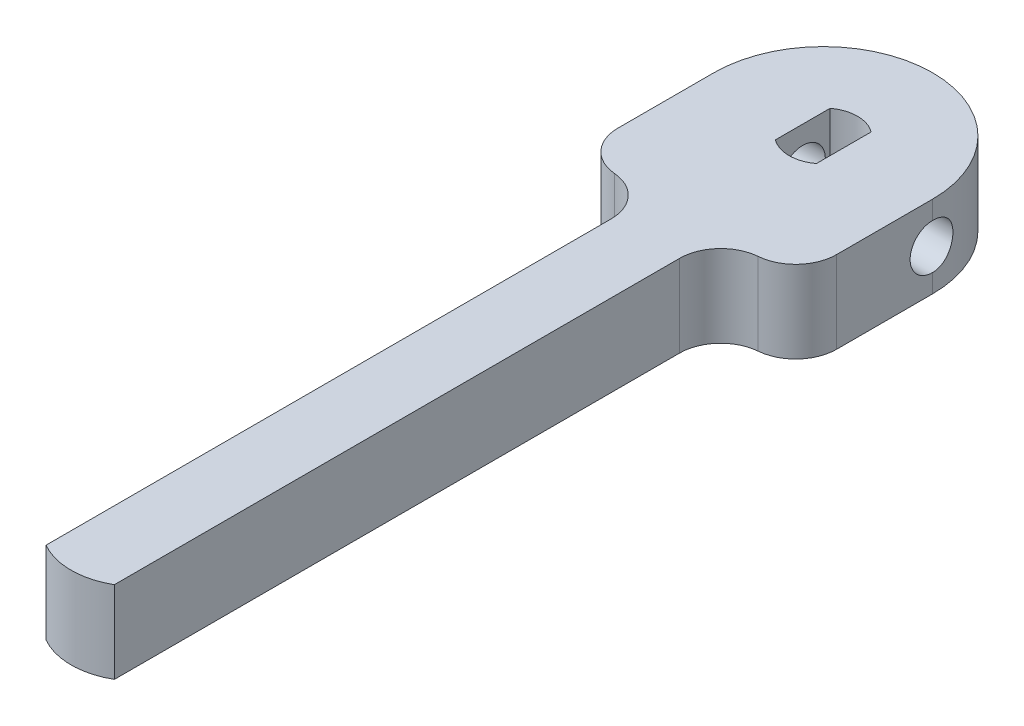
ISO-10303-21;
HEADER;
FILE_DESCRIPTION(('STEP AP214'),'2;1');
FILE_NAME('part.step','',(''),(''),'','','');
FILE_SCHEMA(('AUTOMOTIVE_DESIGN { 1 0 10303 214 1 1 1 1 }'));
ENDSEC;
DATA;
#1=APPLICATION_CONTEXT('core data for automotive mechanical design processes');
#2=APPLICATION_PROTOCOL_DEFINITION('international standard','automotive_design',2000,#1);
#3=PRODUCT_CONTEXT('',#1,'mechanical');
#4=PRODUCT('Part','Part','',(#3));
#5=PRODUCT_RELATED_PRODUCT_CATEGORY('part','',(#4));
#6=PRODUCT_DEFINITION_FORMATION('','',#4);
#7=PRODUCT_DEFINITION_CONTEXT('part definition',#1,'design');
#8=PRODUCT_DEFINITION('design','',#6,#7);
#9=PRODUCT_DEFINITION_SHAPE('','',#8);
#10=(LENGTH_UNIT() NAMED_UNIT(*) SI_UNIT(.MILLI.,.METRE.));
#11=(NAMED_UNIT(*) PLANE_ANGLE_UNIT() SI_UNIT($,.RADIAN.));
#12=(NAMED_UNIT(*) SI_UNIT($,.STERADIAN.) SOLID_ANGLE_UNIT());
#13=UNCERTAINTY_MEASURE_WITH_UNIT(LENGTH_MEASURE(1.E-05),#10,'distance_accuracy_value','');
#14=(GEOMETRIC_REPRESENTATION_CONTEXT(3) GLOBAL_UNCERTAINTY_ASSIGNED_CONTEXT((#13)) GLOBAL_UNIT_ASSIGNED_CONTEXT((#10,
#11,#12)) REPRESENTATION_CONTEXT('',''));
#15=CARTESIAN_POINT('',(0.,0.,0.));
#16=DIRECTION('',(0.,0.,1.));
#17=DIRECTION('',(1.,0.,0.));
#18=AXIS2_PLACEMENT_3D('',#15,#16,#17);
#19=CARTESIAN_POINT('',(0.,6.,0.));
#20=DIRECTION('',(0.,1.,0.));
#21=DIRECTION('',(0.,0.,1.));
#22=AXIS2_PLACEMENT_3D('',#19,#20,#21);
#23=PLANE('',#22);
#24=CARTESIAN_POINT('',(5.5,6.,13.));
#25=DIRECTION('',(0.,1.,0.));
#26=DIRECTION('',(0.,0.,1.));
#27=AXIS2_PLACEMENT_3D('',#24,#25,#26);
#28=CIRCLE('',#27,3.);
#29=CARTESIAN_POINT('',(2.5,6.,13.));
#30=VERTEX_POINT('',#29);
#31=CARTESIAN_POINT('',(5.25,6.,10.0104348142246));
#32=VERTEX_POINT('',#31);
#33=EDGE_CURVE('E419',#30,#32,#28,.F.);
#34=ORIENTED_EDGE('',*,*,#33,.T.);
#35=CARTESIAN_POINT('',(5.,6.,7.0208696284493));
#36=DIRECTION('',(0.,1.,0.));
#37=DIRECTION('',(0.,0.,1.));
#38=AXIS2_PLACEMENT_3D('',#35,#36,#37);
#39=CIRCLE('',#38,3.);
#40=CARTESIAN_POINT('',(8.,6.,7.0208696284493));
#41=VERTEX_POINT('',#40);
#42=EDGE_CURVE('E13',#32,#41,#39,.T.);
#43=ORIENTED_EDGE('',*,*,#42,.T.);
#44=DIRECTION('',(0.,0.,1.));
#45=VECTOR('',#44,1.);
#46=CARTESIAN_POINT('',(8.,6.,0.));
#47=LINE('',#46,#45);
#48=CARTESIAN_POINT('',(8.,6.,0.));
#49=VERTEX_POINT('',#48);
#50=EDGE_CURVE('E480',#49,#41,#47,.T.);
#51=ORIENTED_EDGE('',*,*,#50,.F.);
#52=CARTESIAN_POINT('',(0.,6.,0.));
#53=DIRECTION('',(0.,1.,0.));
#54=DIRECTION('',(0.,0.,1.));
#55=AXIS2_PLACEMENT_3D('',#52,#53,#54);
#56=CIRCLE('',#55,8.);
#57=CARTESIAN_POINT('',(-8.,6.,0.));
#58=VERTEX_POINT('',#57);
#59=EDGE_CURVE('E294',#49,#58,#56,.T.);
#60=ORIENTED_EDGE('',*,*,#59,.T.);
#61=DIRECTION('',(0.,0.,1.));
#62=VECTOR('',#61,1.);
#63=CARTESIAN_POINT('',(-8.,6.,0.));
#64=LINE('',#63,#62);
#65=CARTESIAN_POINT('',(-8.,6.,7.0208696284493));
#66=VERTEX_POINT('',#65);
#67=EDGE_CURVE('E300',#58,#66,#64,.T.);
#68=ORIENTED_EDGE('',*,*,#67,.T.);
#69=CARTESIAN_POINT('',(-5.,6.,7.0208696284493));
#70=DIRECTION('',(0.,1.,0.));
#71=DIRECTION('',(0.,0.,1.));
#72=AXIS2_PLACEMENT_3D('',#69,#70,#71);
#73=CIRCLE('',#72,3.);
#74=CARTESIAN_POINT('',(-5.25,6.,10.0104348142247));
#75=VERTEX_POINT('',#74);
#76=EDGE_CURVE('E334',#66,#75,#73,.T.);
#77=ORIENTED_EDGE('',*,*,#76,.T.);
#78=CARTESIAN_POINT('',(-5.5,6.,13.));
#79=DIRECTION('',(0.,1.,0.));
#80=DIRECTION('',(0.,0.,1.));
#81=AXIS2_PLACEMENT_3D('',#78,#79,#80);
#82=CIRCLE('',#81,3.);
#83=CARTESIAN_POINT('',(-2.5,6.,13.));
#84=VERTEX_POINT('',#83);
#85=EDGE_CURVE('E523',#75,#84,#82,.F.);
#86=ORIENTED_EDGE('',*,*,#85,.T.);
#87=DIRECTION('',(0.,0.,1.));
#88=VECTOR('',#87,1.);
#89=CARTESIAN_POINT('',(-2.5,6.,10.));
#90=LINE('',#89,#88);
#91=CARTESIAN_POINT('',(-2.49999999999999,6.,54.3301270189222));
#92=VERTEX_POINT('',#91);
#93=EDGE_CURVE('E533',#84,#92,#90,.T.);
#94=ORIENTED_EDGE('',*,*,#93,.T.);
#95=CARTESIAN_POINT('',(0.,6.,50.));
#96=DIRECTION('',(0.,1.,0.));
#97=DIRECTION('',(0.,0.,1.));
#98=AXIS2_PLACEMENT_3D('',#95,#96,#97);
#99=CIRCLE('',#98,5.);
#100=CARTESIAN_POINT('',(2.50000000000001,6.,54.3301270189222));
#101=VERTEX_POINT('',#100);
#102=EDGE_CURVE('E481',#92,#101,#99,.T.);
#103=ORIENTED_EDGE('',*,*,#102,.T.);
#104=DIRECTION('',(0.,0.,1.));
#105=VECTOR('',#104,1.);
#106=CARTESIAN_POINT('',(2.5,6.,10.));
#107=LINE('',#106,#105);
#108=EDGE_CURVE('E476',#30,#101,#107,.T.);
#109=ORIENTED_EDGE('',*,*,#108,.F.);
#110=EDGE_LOOP('',(#34,#43,#51,#60,#68,#77,#86,#94,#103,#109));
#111=FACE_BOUND('',#110,.T.);
#112=CARTESIAN_POINT('',(0.,6.,0.));
#113=DIRECTION('',(0.,1.,0.));
#114=DIRECTION('',(0.,0.,1.));
#115=AXIS2_PLACEMENT_3D('',#112,#113,#114);
#116=CIRCLE('',#115,2.5);
#117=CARTESIAN_POINT('',(-1.5,6.,2.));
#118=VERTEX_POINT('',#117);
#119=CARTESIAN_POINT('',(1.5,6.,2.));
#120=VERTEX_POINT('',#119);
#121=EDGE_CURVE('E355',#118,#120,#116,.T.);
#122=ORIENTED_EDGE('',*,*,#121,.F.);
#123=DIRECTION('',(0.,0.,1.));
#124=VECTOR('',#123,1.);
#125=CARTESIAN_POINT('',(-1.5,6.,-2.));
#126=LINE('',#125,#124);
#127=CARTESIAN_POINT('',(-1.5,6.,-2.));
#128=VERTEX_POINT('',#127);
#129=EDGE_CURVE('E360',#128,#118,#126,.T.);
#130=ORIENTED_EDGE('',*,*,#129,.F.);
#131=CARTESIAN_POINT('',(0.,6.,0.));
#132=DIRECTION('',(0.,1.,0.));
#133=DIRECTION('',(0.,0.,1.));
#134=AXIS2_PLACEMENT_3D('',#131,#132,#133);
#135=CIRCLE('',#134,2.5);
#136=CARTESIAN_POINT('',(1.5,6.,-2.));
#137=VERTEX_POINT('',#136);
#138=EDGE_CURVE('E459',#137,#128,#135,.T.);
#139=ORIENTED_EDGE('',*,*,#138,.F.);
#140=DIRECTION('',(0.,0.,1.));
#141=VECTOR('',#140,1.);
#142=CARTESIAN_POINT('',(1.5,6.,-2.));
#143=LINE('',#142,#141);
#144=EDGE_CURVE('E359',#137,#120,#143,.T.);
#145=ORIENTED_EDGE('',*,*,#144,.T.);
#146=EDGE_LOOP('',(#122,#130,#139,#145));
#147=FACE_BOUND('',#146,.T.);
#148=ADVANCED_FACE('F83',(#111,#147),#23,.T.);
#149=CARTESIAN_POINT('',(0.,0.,0.));
#150=DIRECTION('',(0.,1.,0.));
#151=DIRECTION('',(0.,0.,1.));
#152=AXIS2_PLACEMENT_3D('',#149,#150,#151);
#153=PLANE('',#152);
#154=DIRECTION('',(0.,0.,1.));
#155=VECTOR('',#154,1.);
#156=CARTESIAN_POINT('',(8.,0.,0.));
#157=LINE('',#156,#155);
#158=CARTESIAN_POINT('',(8.,0.,0.));
#159=VERTEX_POINT('',#158);
#160=CARTESIAN_POINT('',(8.,0.,7.0208696284493));
#161=VERTEX_POINT('',#160);
#162=EDGE_CURVE('E301',#159,#161,#157,.T.);
#163=ORIENTED_EDGE('',*,*,#162,.T.);
#164=CARTESIAN_POINT('',(5.,0.,7.0208696284493));
#165=DIRECTION('',(0.,1.,0.));
#166=DIRECTION('',(0.,0.,1.));
#167=AXIS2_PLACEMENT_3D('',#164,#165,#166);
#168=CIRCLE('',#167,3.);
#169=CARTESIAN_POINT('',(5.25,0.,10.0104348142246));
#170=VERTEX_POINT('',#169);
#171=EDGE_CURVE('E113',#161,#170,#168,.F.);
#172=ORIENTED_EDGE('',*,*,#171,.T.);
#173=CARTESIAN_POINT('',(5.5,0.,13.));
#174=DIRECTION('',(0.,1.,0.));
#175=DIRECTION('',(0.,0.,1.));
#176=AXIS2_PLACEMENT_3D('',#173,#174,#175);
#177=CIRCLE('',#176,3.);
#178=CARTESIAN_POINT('',(2.5,0.,13.));
#179=VERTEX_POINT('',#178);
#180=EDGE_CURVE('E340',#170,#179,#177,.T.);
#181=ORIENTED_EDGE('',*,*,#180,.T.);
#182=DIRECTION('',(0.,0.,1.));
#183=VECTOR('',#182,1.);
#184=CARTESIAN_POINT('',(2.5,0.,10.));
#185=LINE('',#184,#183);
#186=CARTESIAN_POINT('',(2.50000000000001,0.,54.3301270189222));
#187=VERTEX_POINT('',#186);
#188=EDGE_CURVE('E431',#179,#187,#185,.T.);
#189=ORIENTED_EDGE('',*,*,#188,.T.);
#190=CARTESIAN_POINT('',(0.,0.,50.));
#191=DIRECTION('',(0.,1.,0.));
#192=DIRECTION('',(0.,0.,1.));
#193=AXIS2_PLACEMENT_3D('',#190,#191,#192);
#194=CIRCLE('',#193,5.);
#195=CARTESIAN_POINT('',(-2.49999999999999,0.,54.3301270189222));
#196=VERTEX_POINT('',#195);
#197=EDGE_CURVE('E788',#196,#187,#194,.T.);
#198=ORIENTED_EDGE('',*,*,#197,.F.);
#199=DIRECTION('',(0.,0.,1.));
#200=VECTOR('',#199,1.);
#201=CARTESIAN_POINT('',(-2.5,0.,10.));
#202=LINE('',#201,#200);
#203=CARTESIAN_POINT('',(-2.5,0.,13.));
#204=VERTEX_POINT('',#203);
#205=EDGE_CURVE('E317',#204,#196,#202,.T.);
#206=ORIENTED_EDGE('',*,*,#205,.F.);
#207=CARTESIAN_POINT('',(-5.5,0.,13.));
#208=DIRECTION('',(0.,1.,0.));
#209=DIRECTION('',(0.,0.,1.));
#210=AXIS2_PLACEMENT_3D('',#207,#208,#209);
#211=CIRCLE('',#210,3.);
#212=CARTESIAN_POINT('',(-5.25,0.,10.0104348142247));
#213=VERTEX_POINT('',#212);
#214=EDGE_CURVE('E535',#204,#213,#211,.T.);
#215=ORIENTED_EDGE('',*,*,#214,.T.);
#216=CARTESIAN_POINT('',(-5.,0.,7.0208696284493));
#217=DIRECTION('',(0.,1.,0.));
#218=DIRECTION('',(0.,0.,1.));
#219=AXIS2_PLACEMENT_3D('',#216,#217,#218);
#220=CIRCLE('',#219,3.);
#221=CARTESIAN_POINT('',(-8.,0.,7.0208696284493));
#222=VERTEX_POINT('',#221);
#223=EDGE_CURVE('E335',#213,#222,#220,.F.);
#224=ORIENTED_EDGE('',*,*,#223,.T.);
#225=DIRECTION('',(0.,0.,1.));
#226=VECTOR('',#225,1.);
#227=CARTESIAN_POINT('',(-8.,0.,0.));
#228=LINE('',#227,#226);
#229=CARTESIAN_POINT('',(-8.,0.,0.));
#230=VERTEX_POINT('',#229);
#231=EDGE_CURVE('E313',#230,#222,#228,.T.);
#232=ORIENTED_EDGE('',*,*,#231,.F.);
#233=CARTESIAN_POINT('',(0.,0.,0.));
#234=DIRECTION('',(0.,1.,0.));
#235=DIRECTION('',(0.,0.,1.));
#236=AXIS2_PLACEMENT_3D('',#233,#234,#235);
#237=CIRCLE('',#236,8.);
#238=EDGE_CURVE('E254',#159,#230,#237,.T.);
#239=ORIENTED_EDGE('',*,*,#238,.F.);
#240=EDGE_LOOP('',(#163,#172,#181,#189,#198,#206,#215,#224,#232,#239));
#241=FACE_BOUND('',#240,.T.);
#242=DIRECTION('',(0.,0.,1.));
#243=VECTOR('',#242,1.);
#244=CARTESIAN_POINT('',(-1.5,0.,-2.));
#245=LINE('',#244,#243);
#246=CARTESIAN_POINT('',(-1.5,0.,-2.));
#247=VERTEX_POINT('',#246);
#248=CARTESIAN_POINT('',(-1.5,0.,2.));
#249=VERTEX_POINT('',#248);
#250=EDGE_CURVE('E452',#247,#249,#245,.T.);
#251=ORIENTED_EDGE('',*,*,#250,.T.);
#252=CARTESIAN_POINT('',(0.,0.,0.));
#253=DIRECTION('',(0.,1.,0.));
#254=DIRECTION('',(0.,0.,1.));
#255=AXIS2_PLACEMENT_3D('',#252,#253,#254);
#256=CIRCLE('',#255,2.5);
#257=CARTESIAN_POINT('',(1.5,0.,2.));
#258=VERTEX_POINT('',#257);
#259=EDGE_CURVE('E390',#249,#258,#256,.T.);
#260=ORIENTED_EDGE('',*,*,#259,.T.);
#261=DIRECTION('',(0.,0.,1.));
#262=VECTOR('',#261,1.);
#263=CARTESIAN_POINT('',(1.5,0.,-2.));
#264=LINE('',#263,#262);
#265=CARTESIAN_POINT('',(1.5,0.,-2.));
#266=VERTEX_POINT('',#265);
#267=EDGE_CURVE('E385',#266,#258,#264,.T.);
#268=ORIENTED_EDGE('',*,*,#267,.F.);
#269=CARTESIAN_POINT('',(0.,0.,0.));
#270=DIRECTION('',(0.,1.,0.));
#271=DIRECTION('',(0.,0.,1.));
#272=AXIS2_PLACEMENT_3D('',#269,#270,#271);
#273=CIRCLE('',#272,2.5);
#274=EDGE_CURVE('E389',#266,#247,#273,.T.);
#275=ORIENTED_EDGE('',*,*,#274,.T.);
#276=EDGE_LOOP('',(#251,#260,#268,#275));
#277=FACE_BOUND('',#276,.T.);
#278=ADVANCED_FACE('F617',(#241,#277),#153,.F.);
#279=CARTESIAN_POINT('',(0.,6.,0.));
#280=DIRECTION('',(0.,-1.,0.));
#281=DIRECTION('',(0.,0.,-1.));
#282=AXIS2_PLACEMENT_3D('',#279,#280,#281);
#283=CYLINDRICAL_SURFACE('',#282,8.);
#284=DIRECTION('',(0.,-1.,0.));
#285=VECTOR('',#284,1.);
#286=CARTESIAN_POINT('',(8.,6.,0.));
#287=LINE('',#286,#285);
#288=CARTESIAN_POINT('',(8.,4.65,0.));
#289=VERTEX_POINT('',#288);
#290=EDGE_CURVE('E433',#49,#289,#287,.T.);
#291=ORIENTED_EDGE('',*,*,#290,.T.);
#292=CARTESIAN_POINT('',(8.,4.65,0.));
#293=CARTESIAN_POINT('',(8.00000218404746,4.65000025189228,-0.0459042515674469));
#294=CARTESIAN_POINT('',(7.99960441014387,4.64808314628264,-0.0917860522469184));
#295=CARTESIAN_POINT('',(7.9980321656926,4.6404387117671,-0.18321210904985));
#296=CARTESIAN_POINT('',(7.99685779049357,4.63471185061043,-0.228756405916899));
#297=CARTESIAN_POINT('',(7.99221195309917,4.61188959596379,-0.36424181251276));
#298=CARTESIAN_POINT('',(7.98761755622564,4.58915225288184,-0.453260750355496));
#299=CARTESIAN_POINT('',(7.97593292752806,4.52933200153177,-0.626116828671123));
#300=CARTESIAN_POINT('',(7.96884241170537,4.49224746084821,-0.709953378235689));
#301=CARTESIAN_POINT('',(7.95293508273903,4.4048197707234,-0.870236944330482));
#302=CARTESIAN_POINT('',(7.94411808720962,4.35447522029735,-0.946683178870441));
#303=CARTESIAN_POINT('',(7.9255869054769,4.24120134661534,-1.09107651065266));
#304=CARTESIAN_POINT('',(7.91586271806097,4.1781198298891,-1.15890288894237));
#305=CARTESIAN_POINT('',(7.89668403332823,4.04148255836524,-1.28309736459271));
#306=CARTESIAN_POINT('',(7.88722958156208,3.96792504689115,-1.33946353638242));
#307=CARTESIAN_POINT('',(7.86956305183,3.8115452232431,-1.43965257031042));
#308=CARTESIAN_POINT('',(7.86136392622447,3.72863989886219,-1.48334834632755));
#309=CARTESIAN_POINT('',(7.84728053767301,3.55647133315623,-1.55613995307075));
#310=CARTESIAN_POINT('',(7.84139590397873,3.46720911282232,-1.58523812232951));
#311=CARTESIAN_POINT('',(7.83270939743359,3.28616910207121,-1.62761465362289));
#312=CARTESIAN_POINT('',(7.82986584231192,3.19444347114612,-1.64110712881989));
#313=CARTESIAN_POINT('',(7.82745807012321,3.00998761500969,-1.65255465274119));
#314=CARTESIAN_POINT('',(7.82789357226345,2.91725747649552,-1.6505110318546));
#315=CARTESIAN_POINT('',(7.83195699998865,2.73500423430083,-1.63111664832405));
#316=CARTESIAN_POINT('',(7.83553342693055,2.64545353478559,-1.61401280160571));
#317=CARTESIAN_POINT('',(7.84539449949227,2.47052122767398,-1.56537383413131));
#318=CARTESIAN_POINT('',(7.8516792615614,2.38513979951806,-1.5338380928486));
#319=CARTESIAN_POINT('',(7.86630102273378,2.22026180378528,-1.45699719983786));
#320=CARTESIAN_POINT('',(7.87465241705807,2.14081183369944,-1.41159491703838));
#321=CARTESIAN_POINT('',(7.89245699613901,1.99056855769705,-1.30837948700633));
#322=CARTESIAN_POINT('',(7.90191028073197,1.91977603737773,-1.25056521479051));
#323=CARTESIAN_POINT('',(7.92107496463918,1.78743877526202,-1.1228582787284));
#324=CARTESIAN_POINT('',(7.93078785056551,1.72609587719253,-1.05275651671626));
#325=CARTESIAN_POINT('',(7.94921538806868,1.61599086911173,-0.9031312957744));
#326=CARTESIAN_POINT('',(7.957929770889,1.56723214184621,-0.823605311888762));
#327=CARTESIAN_POINT('',(7.97340333664529,1.48363669479225,-0.65714633817139));
#328=CARTESIAN_POINT('',(7.98015800896966,1.44883202350509,-0.570196847450905));
#329=CARTESIAN_POINT('',(7.99090973653817,1.39442837920221,-0.391569851830386));
#330=CARTESIAN_POINT('',(7.99491086058143,1.37480696518338,-0.299899539072765));
#331=CARTESIAN_POINT('',(7.99820615186391,1.35871632654462,-0.172908076637613));
#332=CARTESIAN_POINT('',(7.99887815860001,1.35544660216687,-0.138380519272959));
#333=CARTESIAN_POINT('',(7.99977470711936,1.35109115937586,-0.069240525028847));
#334=CARTESIAN_POINT('',(8.00000000099656,1.35000177008135,-0.0346283292134946));
#335=CARTESIAN_POINT('',(8.,1.35,0.));
#336=B_SPLINE_CURVE_WITH_KNOTS('',3,(#292,#293,#294,#295,#296,#297,#298,#299,#300,#301,#302,
#303,#304,#305,#306,#307,#308,#309,#310,#311,#312,#313,#314,#315,#316,#317,#318,#319,#320,#321,
#322,#323,#324,#325,#326,#327,#328,#329,#330,#331,#332,#333,#334,#335),.UNSPECIFIED.,.F.,.F.,(4,
2,2,2,2,2,2,2,2,2,2,2,2,2,2,2,2,2,2,2,2,4),(0.,0.137626687059592,0.275236479885645,
0.549788871381422,0.824372510472881,1.09898517231229,1.3770972442476,1.65525600668213,
1.93611520426662,2.21692939390351,2.49384326130825,2.77073341625391,3.04316669848839,
3.31561169560898,3.59001064742394,3.86443448039505,4.14408569138809,4.42381199719713,
4.70417712429597,4.98412707327997,5.0881373003643,5.19197226472719),.UNSPECIFIED.);
#337=CARTESIAN_POINT('',(8.,1.35,0.));
#338=VERTEX_POINT('',#337);
#339=EDGE_CURVE('E238',#289,#338,#336,.T.);
#340=ORIENTED_EDGE('',*,*,#339,.T.);
#341=EDGE_CURVE('E502',#338,#159,#287,.T.);
#342=ORIENTED_EDGE('',*,*,#341,.T.);
#343=ORIENTED_EDGE('',*,*,#238,.T.);
#344=DIRECTION('',(0.,-1.,0.));
#345=VECTOR('',#344,1.);
#346=CARTESIAN_POINT('',(-8.,6.,0.));
#347=LINE('',#346,#345);
#348=CARTESIAN_POINT('',(-8.00000000000001,1.35,0.));
#349=VERTEX_POINT('',#348);
#350=EDGE_CURVE('E244',#349,#230,#347,.T.);
#351=ORIENTED_EDGE('',*,*,#350,.F.);
#352=CARTESIAN_POINT('',(-8.,1.35,0.));
#353=CARTESIAN_POINT('',(-8.00000218404746,1.34999974810772,-0.0459042515674448));
#354=CARTESIAN_POINT('',(-7.99960441014387,1.35191685371736,-0.0917860522469164));
#355=CARTESIAN_POINT('',(-7.9980321656926,1.3595612882329,-0.183212109049848));
#356=CARTESIAN_POINT('',(-7.99685779049357,1.36528814938957,-0.228756405916897));
#357=CARTESIAN_POINT('',(-7.99221195309917,1.38811040403621,-0.364241812512758));
#358=CARTESIAN_POINT('',(-7.98761755622564,1.41084774711816,-0.453260750355494));
#359=CARTESIAN_POINT('',(-7.97593292752806,1.47066799846824,-0.626116828671121));
#360=CARTESIAN_POINT('',(-7.96884241170537,1.50775253915179,-0.709953378235686));
#361=CARTESIAN_POINT('',(-7.95293508273903,1.59518022927661,-0.870236944330479));
#362=CARTESIAN_POINT('',(-7.94411808720962,1.64552477970265,-0.946683178870438));
#363=CARTESIAN_POINT('',(-7.9255869054769,1.75879865338466,-1.09107651065266));
#364=CARTESIAN_POINT('',(-7.91586271806097,1.8218801701109,-1.15890288894237));
#365=CARTESIAN_POINT('',(-7.89668403332823,1.95851744163476,-1.2830973645927));
#366=CARTESIAN_POINT('',(-7.88722958156208,2.03207495310885,-1.33946353638241));
#367=CARTESIAN_POINT('',(-7.86956305183,2.1884547767569,-1.43965257031041));
#368=CARTESIAN_POINT('',(-7.86136392622447,2.27136010113781,-1.48334834632754));
#369=CARTESIAN_POINT('',(-7.84728053767301,2.44352866684377,-1.55613995307075));
#370=CARTESIAN_POINT('',(-7.84139590397873,2.53279088717768,-1.5852381223295));
#371=CARTESIAN_POINT('',(-7.83270939743359,2.71383089792879,-1.62761465362289));
#372=CARTESIAN_POINT('',(-7.82986584231192,2.80555652885388,-1.64110712881988));
#373=CARTESIAN_POINT('',(-7.82745807012321,2.99001238499031,-1.65255465274119));
#374=CARTESIAN_POINT('',(-7.82789357226345,3.08274252350448,-1.6505110318546));
#375=CARTESIAN_POINT('',(-7.83195699998864,3.26499576569917,-1.63111664832405));
#376=CARTESIAN_POINT('',(-7.83553342693055,3.35454646521441,-1.6140128016057));
#377=CARTESIAN_POINT('',(-7.84539449949227,3.52947877232602,-1.56537383413131));
#378=CARTESIAN_POINT('',(-7.8516792615614,3.61486020048194,-1.5338380928486));
#379=CARTESIAN_POINT('',(-7.86630102273378,3.77973819621472,-1.45699719983786));
#380=CARTESIAN_POINT('',(-7.87465241705807,3.85918816630056,-1.41159491703838));
#381=CARTESIAN_POINT('',(-7.89245699613902,4.00943144230295,-1.30837948700633));
#382=CARTESIAN_POINT('',(-7.90191028073197,4.08022396262227,-1.25056521479051));
#383=CARTESIAN_POINT('',(-7.92107496463918,4.21256122473798,-1.1228582787284));
#384=CARTESIAN_POINT('',(-7.93078785056551,4.27390412280747,-1.05275651671626));
#385=CARTESIAN_POINT('',(-7.94921538806869,4.38400913088827,-0.903131295774398));
#386=CARTESIAN_POINT('',(-7.957929770889,4.43276785815379,-0.823605311888759));
#387=CARTESIAN_POINT('',(-7.97340333664529,4.51636330520775,-0.657146338171388));
#388=CARTESIAN_POINT('',(-7.98015800896966,4.5511679764949,-0.570196847450903));
#389=CARTESIAN_POINT('',(-7.99090973653817,4.60557162079779,-0.391569851830384));
#390=CARTESIAN_POINT('',(-7.99491086058143,4.62519303481662,-0.299899539072763));
#391=CARTESIAN_POINT('',(-7.99820615186391,4.64128367345538,-0.172908076637611));
#392=CARTESIAN_POINT('',(-7.99887815860001,4.64455339783313,-0.138380519272957));
#393=CARTESIAN_POINT('',(-7.99977470711936,4.64890884062414,-0.0692405250288453));
#394=CARTESIAN_POINT('',(-8.00000000099656,4.64999822991865,-0.0346283292134929));
#395=CARTESIAN_POINT('',(-8.,4.65,0.));
#396=B_SPLINE_CURVE_WITH_KNOTS('',3,(#352,#353,#354,#355,#356,#357,#358,#359,#360,#361,#362,
#363,#364,#365,#366,#367,#368,#369,#370,#371,#372,#373,#374,#375,#376,#377,#378,#379,#380,#381,
#382,#383,#384,#385,#386,#387,#388,#389,#390,#391,#392,#393,#394,#395),.UNSPECIFIED.,.F.,.F.,(4,
2,2,2,2,2,2,2,2,2,2,2,2,2,2,2,2,2,2,2,2,4),(0.,0.137626687059592,0.275236479885645,
0.549788871381421,0.82437251047288,1.09898517231229,1.3770972442476,1.65525600668213,
1.93611520426662,2.21692939390351,2.49384326130825,2.77073341625391,3.04316669848839,
3.31561169560898,3.59001064742394,3.86443448039504,4.14408569138809,4.42381199719712,
4.70417712429597,4.98412707327997,5.0881373003643,5.19197226472718),.UNSPECIFIED.);
#397=CARTESIAN_POINT('',(-8.,4.65,0.));
#398=VERTEX_POINT('',#397);
#399=EDGE_CURVE('E229',#349,#398,#396,.T.);
#400=ORIENTED_EDGE('',*,*,#399,.T.);
#401=EDGE_CURVE('E239',#58,#398,#347,.T.);
#402=ORIENTED_EDGE('',*,*,#401,.F.);
#403=ORIENTED_EDGE('',*,*,#59,.F.);
#404=EDGE_LOOP('',(#291,#340,#342,#343,#351,#400,#402,#403));
#405=FACE_BOUND('',#404,.T.);
#406=ADVANCED_FACE('F252',(#405),#283,.T.);
#407=CARTESIAN_POINT('',(-8.,6.,0.));
#408=DIRECTION('',(1.,0.,0.));
#409=DIRECTION('',(0.,0.,-1.));
#410=AXIS2_PLACEMENT_3D('',#407,#408,#409);
#411=PLANE('',#410);
#412=ORIENTED_EDGE('',*,*,#231,.T.);
#413=DIRECTION('',(0.,1.,0.));
#414=VECTOR('',#413,1.);
#415=CARTESIAN_POINT('',(-8.,6.,7.0208696284493));
#416=LINE('',#415,#414);
#417=EDGE_CURVE('E329',#222,#66,#416,.T.);
#418=ORIENTED_EDGE('',*,*,#417,.T.);
#419=ORIENTED_EDGE('',*,*,#67,.F.);
#420=ORIENTED_EDGE('',*,*,#401,.T.);
#421=CARTESIAN_POINT('',(-8.00000000000001,3.,0.));
#422=DIRECTION('',(1.,0.,0.));
#423=DIRECTION('',(0.,0.,-1.));
#424=AXIS2_PLACEMENT_3D('',#421,#422,#423);
#425=CIRCLE('',#424,1.65);
#426=EDGE_CURVE('E232',#398,#349,#425,.T.);
#427=ORIENTED_EDGE('',*,*,#426,.T.);
#428=ORIENTED_EDGE('',*,*,#350,.T.);
#429=EDGE_LOOP('',(#412,#418,#419,#420,#427,#428));
#430=FACE_BOUND('',#429,.T.);
#431=ADVANCED_FACE('F243',(#430),#411,.F.);
#432=CARTESIAN_POINT('',(-2.5,6.,10.));
#433=DIRECTION('',(1.,0.,0.));
#434=DIRECTION('',(0.,0.,-1.));
#435=AXIS2_PLACEMENT_3D('',#432,#433,#434);
#436=PLANE('',#435);
#437=ORIENTED_EDGE('',*,*,#93,.F.);
#438=DIRECTION('',(0.,-1.,0.));
#439=VECTOR('',#438,1.);
#440=CARTESIAN_POINT('',(-2.5,0.,13.));
#441=LINE('',#440,#439);
#442=EDGE_CURVE('E554',#84,#204,#441,.T.);
#443=ORIENTED_EDGE('',*,*,#442,.T.);
#444=ORIENTED_EDGE('',*,*,#205,.T.);
#445=DIRECTION('',(0.,-1.,0.));
#446=VECTOR('',#445,1.);
#447=CARTESIAN_POINT('',(-2.49999999999999,6.,54.3301270189222));
#448=LINE('',#447,#446);
#449=EDGE_CURVE('E256',#92,#196,#448,.T.);
#450=ORIENTED_EDGE('',*,*,#449,.F.);
#451=EDGE_LOOP('',(#437,#443,#444,#450));
#452=FACE_BOUND('',#451,.T.);
#453=ADVANCED_FACE('F630',(#452),#436,.F.);
#454=CARTESIAN_POINT('',(0.,6.,50.));
#455=DIRECTION('',(0.,-1.,0.));
#456=DIRECTION('',(0.,0.,-1.));
#457=AXIS2_PLACEMENT_3D('',#454,#455,#456);
#458=CYLINDRICAL_SURFACE('',#457,5.);
#459=ORIENTED_EDGE('',*,*,#197,.T.);
#460=DIRECTION('',(0.,-1.,0.));
#461=VECTOR('',#460,1.);
#462=CARTESIAN_POINT('',(2.50000000000001,6.,54.3301270189222));
#463=LINE('',#462,#461);
#464=EDGE_CURVE('E262',#101,#187,#463,.T.);
#465=ORIENTED_EDGE('',*,*,#464,.F.);
#466=ORIENTED_EDGE('',*,*,#102,.F.);
#467=ORIENTED_EDGE('',*,*,#449,.T.);
#468=EDGE_LOOP('',(#459,#465,#466,#467));
#469=FACE_BOUND('',#468,.T.);
#470=ADVANCED_FACE('F626',(#469),#458,.T.);
#471=CARTESIAN_POINT('',(2.5,6.,10.));
#472=DIRECTION('',(1.,0.,0.));
#473=DIRECTION('',(0.,0.,-1.));
#474=AXIS2_PLACEMENT_3D('',#471,#472,#473);
#475=PLANE('',#474);
#476=ORIENTED_EDGE('',*,*,#188,.F.);
#477=DIRECTION('',(0.,-1.,0.));
#478=VECTOR('',#477,1.);
#479=CARTESIAN_POINT('',(2.5,6.,13.));
#480=LINE('',#479,#478);
#481=EDGE_CURVE('E521',#179,#30,#480,.F.);
#482=ORIENTED_EDGE('',*,*,#481,.T.);
#483=ORIENTED_EDGE('',*,*,#108,.T.);
#484=ORIENTED_EDGE('',*,*,#464,.T.);
#485=EDGE_LOOP('',(#476,#482,#483,#484));
#486=FACE_BOUND('',#485,.T.);
#487=ADVANCED_FACE('F623',(#486),#475,.T.);
#488=CARTESIAN_POINT('',(8.,6.,0.));
#489=DIRECTION('',(1.,0.,0.));
#490=DIRECTION('',(0.,0.,-1.));
#491=AXIS2_PLACEMENT_3D('',#488,#489,#490);
#492=PLANE('',#491);
#493=ORIENTED_EDGE('',*,*,#50,.T.);
#494=DIRECTION('',(0.,-1.,0.));
#495=VECTOR('',#494,1.);
#496=CARTESIAN_POINT('',(8.,0.,7.0208696284493));
#497=LINE('',#496,#495);
#498=EDGE_CURVE('E415',#41,#161,#497,.T.);
#499=ORIENTED_EDGE('',*,*,#498,.T.);
#500=ORIENTED_EDGE('',*,*,#162,.F.);
#501=ORIENTED_EDGE('',*,*,#341,.F.);
#502=CARTESIAN_POINT('',(8.,3.,0.));
#503=DIRECTION('',(1.,0.,0.));
#504=DIRECTION('',(0.,0.,-1.));
#505=AXIS2_PLACEMENT_3D('',#502,#503,#504);
#506=CIRCLE('',#505,1.65);
#507=EDGE_CURVE('E248',#289,#338,#506,.T.);
#508=ORIENTED_EDGE('',*,*,#507,.F.);
#509=ORIENTED_EDGE('',*,*,#290,.F.);
#510=EDGE_LOOP('',(#493,#499,#500,#501,#508,#509));
#511=FACE_BOUND('',#510,.T.);
#512=ADVANCED_FACE('F513',(#511),#492,.T.);
#513=CARTESIAN_POINT('',(-1.5,6.,-2.));
#514=DIRECTION('',(1.,0.,0.));
#515=DIRECTION('',(0.,0.,-1.));
#516=AXIS2_PLACEMENT_3D('',#513,#514,#515);
#517=PLANE('',#516);
#518=CARTESIAN_POINT('',(-1.5,3.,0.));
#519=DIRECTION('',(1.,0.,0.));
#520=DIRECTION('',(0.,0.,-1.));
#521=AXIS2_PLACEMENT_3D('',#518,#519,#520);
#522=CIRCLE('',#521,1.65);
#523=CARTESIAN_POINT('',(-1.5,3.,-1.65));
#524=VERTEX_POINT('',#523);
#525=EDGE_CURVE('E447',#524,#524,#522,.T.);
#526=ORIENTED_EDGE('',*,*,#525,.F.);
#527=EDGE_LOOP('',(#526));
#528=FACE_BOUND('',#527,.T.);
#529=ORIENTED_EDGE('',*,*,#250,.F.);
#530=DIRECTION('',(0.,-1.,0.));
#531=VECTOR('',#530,1.);
#532=CARTESIAN_POINT('',(-1.5,6.,-2.));
#533=LINE('',#532,#531);
#534=EDGE_CURVE('E465',#128,#247,#533,.T.);
#535=ORIENTED_EDGE('',*,*,#534,.F.);
#536=ORIENTED_EDGE('',*,*,#129,.T.);
#537=DIRECTION('',(0.,-1.,0.));
#538=VECTOR('',#537,1.);
#539=CARTESIAN_POINT('',(-1.5,6.,2.));
#540=LINE('',#539,#538);
#541=EDGE_CURVE('E302',#118,#249,#540,.T.);
#542=ORIENTED_EDGE('',*,*,#541,.T.);
#543=EDGE_LOOP('',(#529,#535,#536,#542));
#544=FACE_BOUND('',#543,.T.);
#545=ADVANCED_FACE('F608',(#528,#544),#517,.T.);
#546=CARTESIAN_POINT('',(0.,6.,0.));
#547=DIRECTION('',(0.,-1.,0.));
#548=DIRECTION('',(0.,0.,-1.));
#549=AXIS2_PLACEMENT_3D('',#546,#547,#548);
#550=CYLINDRICAL_SURFACE('',#549,2.5);
#551=ORIENTED_EDGE('',*,*,#259,.F.);
#552=ORIENTED_EDGE('',*,*,#541,.F.);
#553=ORIENTED_EDGE('',*,*,#121,.T.);
#554=DIRECTION('',(0.,-1.,0.));
#555=VECTOR('',#554,1.);
#556=CARTESIAN_POINT('',(1.5,6.,2.));
#557=LINE('',#556,#555);
#558=EDGE_CURVE('E373',#120,#258,#557,.T.);
#559=ORIENTED_EDGE('',*,*,#558,.T.);
#560=EDGE_LOOP('',(#551,#552,#553,#559));
#561=FACE_BOUND('',#560,.T.);
#562=ADVANCED_FACE('F602',(#561),#550,.F.);
#563=CARTESIAN_POINT('',(1.5,6.,-2.));
#564=DIRECTION('',(1.,0.,0.));
#565=DIRECTION('',(0.,0.,-1.));
#566=AXIS2_PLACEMENT_3D('',#563,#564,#565);
#567=PLANE('',#566);
#568=CARTESIAN_POINT('',(1.5,3.,0.));
#569=DIRECTION('',(1.,0.,0.));
#570=DIRECTION('',(0.,0.,-1.));
#571=AXIS2_PLACEMENT_3D('',#568,#569,#570);
#572=CIRCLE('',#571,1.65);
#573=CARTESIAN_POINT('',(1.5,3.,-1.65));
#574=VERTEX_POINT('',#573);
#575=EDGE_CURVE('E247',#574,#574,#572,.T.);
#576=ORIENTED_EDGE('',*,*,#575,.T.);
#577=EDGE_LOOP('',(#576));
#578=FACE_BOUND('',#577,.T.);
#579=ORIENTED_EDGE('',*,*,#267,.T.);
#580=ORIENTED_EDGE('',*,*,#558,.F.);
#581=ORIENTED_EDGE('',*,*,#144,.F.);
#582=DIRECTION('',(0.,-1.,0.));
#583=VECTOR('',#582,1.);
#584=CARTESIAN_POINT('',(1.5,6.,-2.));
#585=LINE('',#584,#583);
#586=EDGE_CURVE('E377',#137,#266,#585,.T.);
#587=ORIENTED_EDGE('',*,*,#586,.T.);
#588=EDGE_LOOP('',(#579,#580,#581,#587));
#589=FACE_BOUND('',#588,.T.);
#590=ADVANCED_FACE('F595',(#578,#589),#567,.F.);
#591=CARTESIAN_POINT('',(0.,6.,0.));
#592=DIRECTION('',(0.,-1.,0.));
#593=DIRECTION('',(0.,0.,-1.));
#594=AXIS2_PLACEMENT_3D('',#591,#592,#593);
#595=CYLINDRICAL_SURFACE('',#594,2.5);
#596=ORIENTED_EDGE('',*,*,#274,.F.);
#597=ORIENTED_EDGE('',*,*,#586,.F.);
#598=ORIENTED_EDGE('',*,*,#138,.T.);
#599=ORIENTED_EDGE('',*,*,#534,.T.);
#600=EDGE_LOOP('',(#596,#597,#598,#599));
#601=FACE_BOUND('',#600,.T.);
#602=ADVANCED_FACE('F590',(#601),#595,.F.);
#603=CARTESIAN_POINT('',(8.,3.,0.));
#604=DIRECTION('',(1.,0.,0.));
#605=DIRECTION('',(0.,0.,-1.));
#606=AXIS2_PLACEMENT_3D('',#603,#604,#605);
#607=CYLINDRICAL_SURFACE('',#606,1.65);
#608=ORIENTED_EDGE('',*,*,#525,.T.);
#609=EDGE_LOOP('',(#608));
#610=FACE_BOUND('',#609,.T.);
#611=ORIENTED_EDGE('',*,*,#426,.F.);
#612=ORIENTED_EDGE('',*,*,#399,.F.);
#613=EDGE_LOOP('',(#611,#612));
#614=FACE_BOUND('',#613,.T.);
#615=ADVANCED_FACE('F231',(#610,#614),#607,.F.);
#616=ORIENTED_EDGE('',*,*,#507,.T.);
#617=ORIENTED_EDGE('',*,*,#339,.F.);
#618=EDGE_LOOP('',(#616,#617));
#619=FACE_BOUND('',#618,.T.);
#620=ORIENTED_EDGE('',*,*,#575,.F.);
#621=EDGE_LOOP('',(#620));
#622=FACE_BOUND('',#621,.T.);
#623=ADVANCED_FACE('F581',(#619,#622),#607,.F.);
#624=CARTESIAN_POINT('',(-5.5,6.,13.));
#625=DIRECTION('',(0.,1.,0.));
#626=DIRECTION('',(0.,0.,1.));
#627=AXIS2_PLACEMENT_3D('',#624,#625,#626);
#628=CYLINDRICAL_SURFACE('',#627,3.);
#629=ORIENTED_EDGE('',*,*,#85,.F.);
#630=DIRECTION('',(0.,1.,0.));
#631=VECTOR('',#630,1.);
#632=CARTESIAN_POINT('',(-5.25,6.,10.0104348142247));
#633=LINE('',#632,#631);
#634=EDGE_CURVE('E522',#75,#213,#633,.F.);
#635=ORIENTED_EDGE('',*,*,#634,.T.);
#636=ORIENTED_EDGE('',*,*,#214,.F.);
#637=ORIENTED_EDGE('',*,*,#442,.F.);
#638=EDGE_LOOP('',(#629,#635,#636,#637));
#639=FACE_BOUND('',#638,.T.);
#640=ADVANCED_FACE('F587',(#639),#628,.F.);
#641=CARTESIAN_POINT('',(5.5,6.,13.));
#642=DIRECTION('',(0.,1.,0.));
#643=DIRECTION('',(0.,0.,1.));
#644=AXIS2_PLACEMENT_3D('',#641,#642,#643);
#645=CYLINDRICAL_SURFACE('',#644,3.);
#646=ORIENTED_EDGE('',*,*,#180,.F.);
#647=DIRECTION('',(0.,1.,0.));
#648=VECTOR('',#647,1.);
#649=CARTESIAN_POINT('',(5.25,6.,10.0104348142246));
#650=LINE('',#649,#648);
#651=EDGE_CURVE('E94',#170,#32,#650,.T.);
#652=ORIENTED_EDGE('',*,*,#651,.T.);
#653=ORIENTED_EDGE('',*,*,#33,.F.);
#654=ORIENTED_EDGE('',*,*,#481,.F.);
#655=EDGE_LOOP('',(#646,#652,#653,#654));
#656=FACE_BOUND('',#655,.T.);
#657=ADVANCED_FACE('F672',(#656),#645,.F.);
#658=CARTESIAN_POINT('',(-5.,6.,7.0208696284493));
#659=DIRECTION('',(0.,1.,0.));
#660=DIRECTION('',(0.,0.,1.));
#661=AXIS2_PLACEMENT_3D('',#658,#659,#660);
#662=CYLINDRICAL_SURFACE('',#661,3.);
#663=ORIENTED_EDGE('',*,*,#76,.F.);
#664=ORIENTED_EDGE('',*,*,#417,.F.);
#665=ORIENTED_EDGE('',*,*,#223,.F.);
#666=ORIENTED_EDGE('',*,*,#634,.F.);
#667=EDGE_LOOP('',(#663,#664,#665,#666));
#668=FACE_BOUND('',#667,.T.);
#669=ADVANCED_FACE('F545',(#668),#662,.T.);
#670=CARTESIAN_POINT('',(5.,6.,7.0208696284493));
#671=DIRECTION('',(0.,1.,0.));
#672=DIRECTION('',(0.,0.,1.));
#673=AXIS2_PLACEMENT_3D('',#670,#671,#672);
#674=CYLINDRICAL_SURFACE('',#673,3.);
#675=ORIENTED_EDGE('',*,*,#42,.F.);
#676=ORIENTED_EDGE('',*,*,#651,.F.);
#677=ORIENTED_EDGE('',*,*,#171,.F.);
#678=ORIENTED_EDGE('',*,*,#498,.F.);
#679=EDGE_LOOP('',(#675,#676,#677,#678));
#680=FACE_BOUND('',#679,.T.);
#681=ADVANCED_FACE('F86',(#680),#674,.T.);
#682=CLOSED_SHELL('',(#148,#278,#406,#431,#453,#470,#487,#512,#545,#562,#590,#602,#615,#623,
#640,#657,#669,#681));
#683=MANIFOLD_SOLID_BREP('B2',#682);
#684=ADVANCED_BREP_SHAPE_REPRESENTATION('',(#18,#683),#14);
#685=SHAPE_DEFINITION_REPRESENTATION(#9,#684);
ENDSEC;
END-ISO-10303-21;
